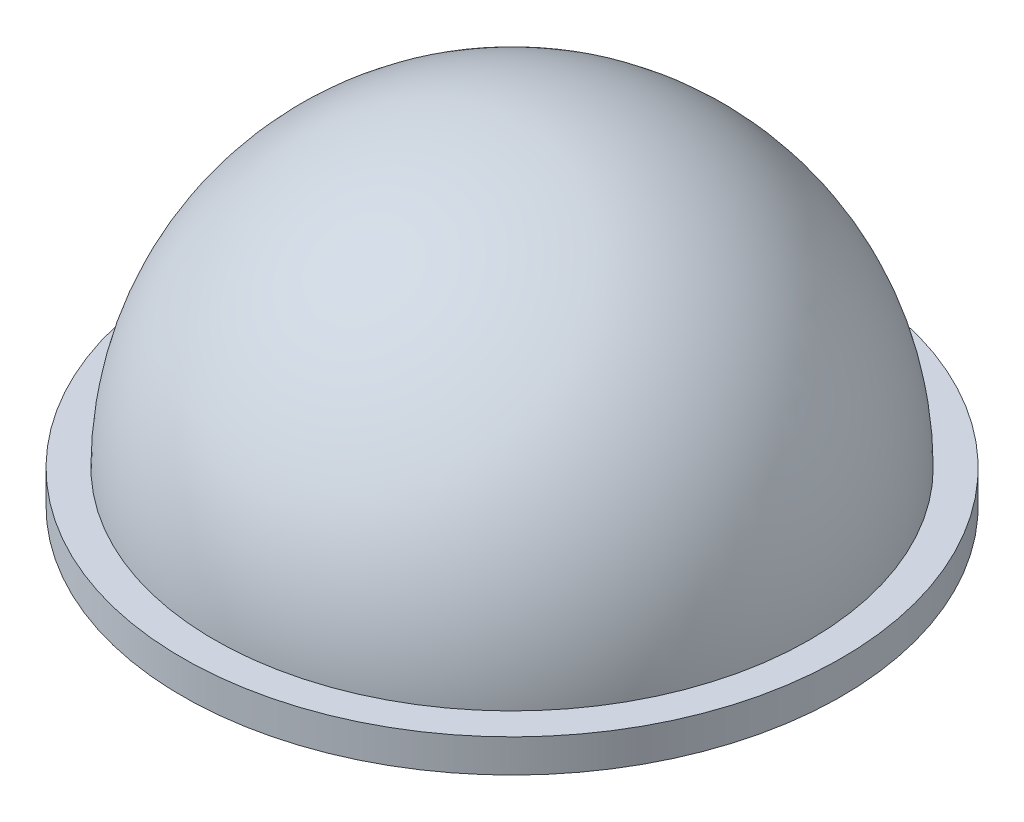
ISO-10303-21;
HEADER;
FILE_DESCRIPTION(('STEP AP214'),'2;1');
FILE_NAME('part.step','',(''),(''),'','','');
FILE_SCHEMA(('AUTOMOTIVE_DESIGN { 1 0 10303 214 1 1 1 1 }'));
ENDSEC;
DATA;
#1=APPLICATION_CONTEXT('core data for automotive mechanical design processes');
#2=APPLICATION_PROTOCOL_DEFINITION('international standard','automotive_design',2000,#1);
#3=PRODUCT_CONTEXT('',#1,'mechanical');
#4=PRODUCT('Part','Part','',(#3));
#5=PRODUCT_RELATED_PRODUCT_CATEGORY('part','',(#4));
#6=PRODUCT_DEFINITION_FORMATION('','',#4);
#7=PRODUCT_DEFINITION_CONTEXT('part definition',#1,'design');
#8=PRODUCT_DEFINITION('design','',#6,#7);
#9=PRODUCT_DEFINITION_SHAPE('','',#8);
#10=(LENGTH_UNIT() NAMED_UNIT(*) SI_UNIT(.MILLI.,.METRE.));
#11=(NAMED_UNIT(*) PLANE_ANGLE_UNIT() SI_UNIT($,.RADIAN.));
#12=(NAMED_UNIT(*) SI_UNIT($,.STERADIAN.) SOLID_ANGLE_UNIT());
#13=UNCERTAINTY_MEASURE_WITH_UNIT(LENGTH_MEASURE(1.E-05),#10,'distance_accuracy_value','');
#14=(GEOMETRIC_REPRESENTATION_CONTEXT(3) GLOBAL_UNCERTAINTY_ASSIGNED_CONTEXT((#13)) GLOBAL_UNIT_ASSIGNED_CONTEXT((#10,
#11,#12)) REPRESENTATION_CONTEXT('',''));
#15=CARTESIAN_POINT('',(0.,0.,0.));
#16=DIRECTION('',(0.,0.,1.));
#17=DIRECTION('',(1.,0.,0.));
#18=AXIS2_PLACEMENT_3D('',#15,#16,#17);
#19=CARTESIAN_POINT('',(0.,0.,0.));
#20=DIRECTION('',(0.,-1.,0.));
#21=DIRECTION('',(1.,0.,0.));
#22=AXIS2_PLACEMENT_3D('',#19,#20,#21);
#23=SPHERICAL_SURFACE('',#22,40.);
#24=CARTESIAN_POINT('',(0.,0.,0.));
#25=DIRECTION('',(0.,-1.,0.));
#26=DIRECTION('',(0.,0.,-1.));
#27=AXIS2_PLACEMENT_3D('',#24,#25,#26);
#28=CIRCLE('',#27,40.);
#29=CARTESIAN_POINT('',(0.,0.,-40.));
#30=VERTEX_POINT('',#29);
#31=EDGE_CURVE('E10',#30,#30,#28,.T.);
#32=ORIENTED_EDGE('',*,*,#31,.T.);
#33=EDGE_LOOP('',(#32));
#34=FACE_BOUND('',#33,.T.);
#35=ADVANCED_FACE('F38',(#34),#23,.F.);
#36=CARTESIAN_POINT('',(0.,0.,0.));
#37=DIRECTION('',(0.,-1.,0.));
#38=DIRECTION('',(0.,0.,-1.));
#39=AXIS2_PLACEMENT_3D('',#36,#37,#38);
#40=CYLINDRICAL_SURFACE('',#39,40.);
#41=CARTESIAN_POINT('',(0.,-4.99999999999999,0.));
#42=DIRECTION('',(0.,-1.,0.));
#43=DIRECTION('',(0.,0.,-1.));
#44=AXIS2_PLACEMENT_3D('',#41,#42,#43);
#45=CIRCLE('',#44,40.);
#46=CARTESIAN_POINT('',(0.,-4.99999999999999,-40.));
#47=VERTEX_POINT('',#46);
#48=EDGE_CURVE('E44',#47,#47,#45,.T.);
#49=ORIENTED_EDGE('',*,*,#48,.T.);
#50=EDGE_LOOP('',(#49));
#51=FACE_BOUND('',#50,.T.);
#52=ORIENTED_EDGE('',*,*,#31,.F.);
#53=EDGE_LOOP('',(#52));
#54=FACE_BOUND('',#53,.T.);
#55=ADVANCED_FACE('F73',(#51,#54),#40,.F.);
#56=CARTESIAN_POINT('',(40.,-4.99999999999999,0.));
#57=DIRECTION('',(0.,-1.,0.));
#58=DIRECTION('',(0.,0.,-1.));
#59=AXIS2_PLACEMENT_3D('',#56,#57,#58);
#60=PLANE('',#59);
#61=CARTESIAN_POINT('',(0.,-4.99999999999999,0.));
#62=DIRECTION('',(0.,-1.,0.));
#63=DIRECTION('',(0.,0.,-1.));
#64=AXIS2_PLACEMENT_3D('',#61,#62,#63);
#65=CIRCLE('',#64,49.8);
#66=CARTESIAN_POINT('',(0.,-4.99999999999999,-49.8));
#67=VERTEX_POINT('',#66);
#68=EDGE_CURVE('E48',#67,#67,#65,.T.);
#69=ORIENTED_EDGE('',*,*,#68,.T.);
#70=EDGE_LOOP('',(#69));
#71=FACE_BOUND('',#70,.T.);
#72=ORIENTED_EDGE('',*,*,#48,.F.);
#73=EDGE_LOOP('',(#72));
#74=FACE_BOUND('',#73,.T.);
#75=ADVANCED_FACE('F77',(#71,#74),#60,.T.);
#76=CARTESIAN_POINT('',(0.,0.,0.));
#77=DIRECTION('',(0.,-1.,0.));
#78=DIRECTION('',(0.,0.,-1.));
#79=AXIS2_PLACEMENT_3D('',#76,#77,#78);
#80=CYLINDRICAL_SURFACE('',#79,49.8);
#81=CARTESIAN_POINT('',(0.,0.,0.));
#82=DIRECTION('',(0.,-1.,0.));
#83=DIRECTION('',(0.,0.,-1.));
#84=AXIS2_PLACEMENT_3D('',#81,#82,#83);
#85=CIRCLE('',#84,49.8);
#86=CARTESIAN_POINT('',(0.,0.,-49.8));
#87=VERTEX_POINT('',#86);
#88=EDGE_CURVE('E52',#87,#87,#85,.T.);
#89=ORIENTED_EDGE('',*,*,#88,.T.);
#90=EDGE_LOOP('',(#89));
#91=FACE_BOUND('',#90,.T.);
#92=ORIENTED_EDGE('',*,*,#68,.F.);
#93=EDGE_LOOP('',(#92));
#94=FACE_BOUND('',#93,.T.);
#95=ADVANCED_FACE('F70',(#91,#94),#80,.T.);
#96=CARTESIAN_POINT('',(45.,0.,0.));
#97=DIRECTION('',(0.,1.,0.));
#98=DIRECTION('',(0.,0.,1.));
#99=AXIS2_PLACEMENT_3D('',#96,#97,#98);
#100=PLANE('',#99);
#101=CARTESIAN_POINT('',(0.,0.,0.));
#102=DIRECTION('',(0.,-1.,0.));
#103=DIRECTION('',(0.,0.,-1.));
#104=AXIS2_PLACEMENT_3D('',#101,#102,#103);
#105=CIRCLE('',#104,45.);
#106=CARTESIAN_POINT('',(0.,0.,-45.));
#107=VERTEX_POINT('',#106);
#108=EDGE_CURVE('E57',#107,#107,#105,.T.);
#109=ORIENTED_EDGE('',*,*,#108,.T.);
#110=EDGE_LOOP('',(#109));
#111=FACE_BOUND('',#110,.T.);
#112=ORIENTED_EDGE('',*,*,#88,.F.);
#113=EDGE_LOOP('',(#112));
#114=FACE_BOUND('',#113,.T.);
#115=ADVANCED_FACE('F61',(#111,#114),#100,.T.);
#116=CARTESIAN_POINT('',(0.,0.,0.));
#117=DIRECTION('',(0.,-1.,0.));
#118=DIRECTION('',(1.,0.,0.));
#119=AXIS2_PLACEMENT_3D('',#116,#117,#118);
#120=SPHERICAL_SURFACE('',#119,45.);
#121=ORIENTED_EDGE('',*,*,#108,.F.);
#122=EDGE_LOOP('',(#121));
#123=FACE_BOUND('',#122,.T.);
#124=ADVANCED_FACE('F64',(#123),#120,.T.);
#125=CLOSED_SHELL('',(#35,#55,#75,#95,#115,#124));
#126=MANIFOLD_SOLID_BREP('B2',#125);
#127=ADVANCED_BREP_SHAPE_REPRESENTATION('',(#18,#126),#14);
#128=SHAPE_DEFINITION_REPRESENTATION(#9,#127);
ENDSEC;
END-ISO-10303-21;
